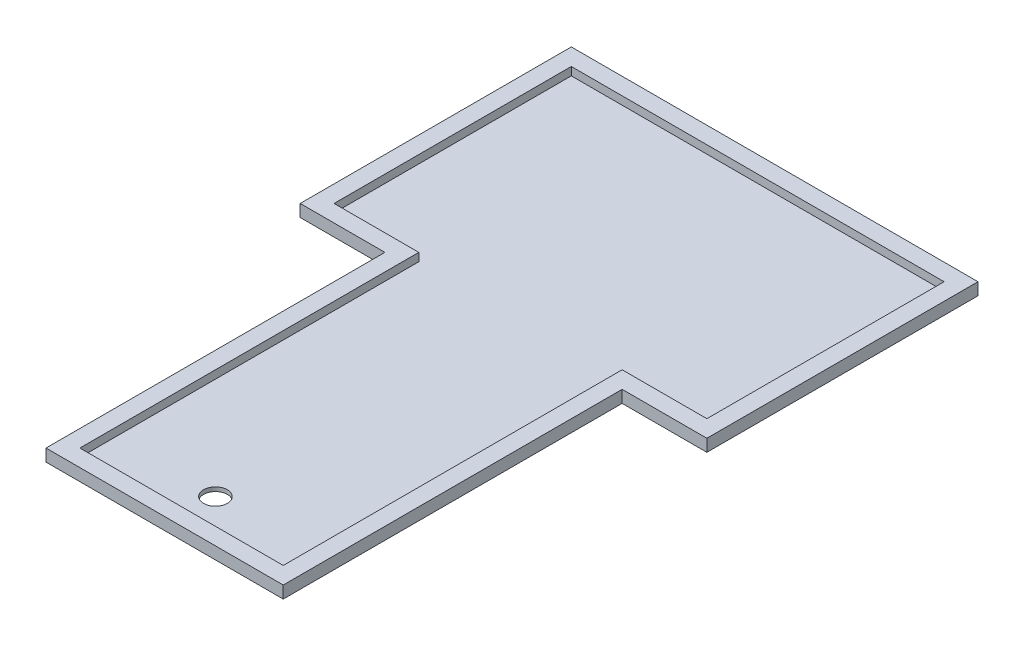
ISO-10303-21;
HEADER;
FILE_DESCRIPTION(('STEP AP214'),'2;1');
FILE_NAME('part.step','',(''),(''),'','','');
FILE_SCHEMA(('AUTOMOTIVE_DESIGN { 1 0 10303 214 1 1 1 1 }'));
ENDSEC;
DATA;
#1=APPLICATION_CONTEXT('core data for automotive mechanical design processes');
#2=APPLICATION_PROTOCOL_DEFINITION('international standard','automotive_design',2000,#1);
#3=PRODUCT_CONTEXT('',#1,'mechanical');
#4=PRODUCT('Part','Part','',(#3));
#5=PRODUCT_RELATED_PRODUCT_CATEGORY('part','',(#4));
#6=PRODUCT_DEFINITION_FORMATION('','',#4);
#7=PRODUCT_DEFINITION_CONTEXT('part definition',#1,'design');
#8=PRODUCT_DEFINITION('design','',#6,#7);
#9=PRODUCT_DEFINITION_SHAPE('','',#8);
#10=(LENGTH_UNIT() NAMED_UNIT(*) SI_UNIT(.MILLI.,.METRE.));
#11=(NAMED_UNIT(*) PLANE_ANGLE_UNIT() SI_UNIT($,.RADIAN.));
#12=(NAMED_UNIT(*) SI_UNIT($,.STERADIAN.) SOLID_ANGLE_UNIT());
#13=UNCERTAINTY_MEASURE_WITH_UNIT(LENGTH_MEASURE(1.E-05),#10,'distance_accuracy_value','');
#14=(GEOMETRIC_REPRESENTATION_CONTEXT(3) GLOBAL_UNCERTAINTY_ASSIGNED_CONTEXT((#13)) GLOBAL_UNIT_ASSIGNED_CONTEXT((#10,
#11,#12)) REPRESENTATION_CONTEXT('',''));
#15=CARTESIAN_POINT('',(0.,0.,0.));
#16=DIRECTION('',(0.,0.,1.));
#17=DIRECTION('',(1.,0.,0.));
#18=AXIS2_PLACEMENT_3D('',#15,#16,#17);
#19=CARTESIAN_POINT('',(0.,1.2,0.));
#20=DIRECTION('',(0.,-1.,0.));
#21=DIRECTION('',(0.,0.,-1.));
#22=AXIS2_PLACEMENT_3D('',#19,#20,#21);
#23=PLANE('',#22);
#24=DIRECTION('',(0.,0.,-1.));
#25=VECTOR('',#24,1.);
#26=CARTESIAN_POINT('',(55.,1.2,35.));
#27=LINE('',#26,#25);
#28=CARTESIAN_POINT('',(55.,1.2,35.));
#29=VERTEX_POINT('',#28);
#30=CARTESIAN_POINT('',(55.,1.2,-35.));
#31=VERTEX_POINT('',#30);
#32=EDGE_CURVE('E159',#29,#31,#27,.T.);
#33=ORIENTED_EDGE('',*,*,#32,.T.);
#34=DIRECTION('',(-1.,0.,0.));
#35=VECTOR('',#34,1.);
#36=CARTESIAN_POINT('',(-55.,1.2,-35.));
#37=LINE('',#36,#35);
#38=CARTESIAN_POINT('',(-55.,1.2,-35.));
#39=VERTEX_POINT('',#38);
#40=EDGE_CURVE('E48',#31,#39,#37,.T.);
#41=ORIENTED_EDGE('',*,*,#40,.T.);
#42=DIRECTION('',(0.,0.,1.));
#43=VECTOR('',#42,1.);
#44=CARTESIAN_POINT('',(-55.,1.2,35.));
#45=LINE('',#44,#43);
#46=CARTESIAN_POINT('',(-55.,1.2,35.));
#47=VERTEX_POINT('',#46);
#48=EDGE_CURVE('E184',#39,#47,#45,.T.);
#49=ORIENTED_EDGE('',*,*,#48,.T.);
#50=DIRECTION('',(1.,0.,0.));
#51=VECTOR('',#50,1.);
#52=CARTESIAN_POINT('',(-55.,1.2,35.));
#53=LINE('',#52,#51);
#54=CARTESIAN_POINT('',(-30.,1.2,35.));
#55=VERTEX_POINT('',#54);
#56=EDGE_CURVE('E187',#47,#55,#53,.T.);
#57=ORIENTED_EDGE('',*,*,#56,.T.);
#58=DIRECTION('',(0.,0.,1.));
#59=VECTOR('',#58,1.);
#60=CARTESIAN_POINT('',(-30.,1.2,135.));
#61=LINE('',#60,#59);
#62=CARTESIAN_POINT('',(-30.,1.2,135.));
#63=VERTEX_POINT('',#62);
#64=EDGE_CURVE('E190',#55,#63,#61,.T.);
#65=ORIENTED_EDGE('',*,*,#64,.T.);
#66=DIRECTION('',(1.,0.,0.));
#67=VECTOR('',#66,1.);
#68=CARTESIAN_POINT('',(30.,1.2,135.));
#69=LINE('',#68,#67);
#70=CARTESIAN_POINT('',(30.,1.2,135.));
#71=VERTEX_POINT('',#70);
#72=EDGE_CURVE('E193',#63,#71,#69,.T.);
#73=ORIENTED_EDGE('',*,*,#72,.T.);
#74=DIRECTION('',(0.,0.,-1.));
#75=VECTOR('',#74,1.);
#76=CARTESIAN_POINT('',(30.,1.2,35.));
#77=LINE('',#76,#75);
#78=CARTESIAN_POINT('',(30.,1.2,35.));
#79=VERTEX_POINT('',#78);
#80=EDGE_CURVE('E196',#71,#79,#77,.T.);
#81=ORIENTED_EDGE('',*,*,#80,.T.);
#82=DIRECTION('',(1.,0.,0.));
#83=VECTOR('',#82,1.);
#84=CARTESIAN_POINT('',(30.,1.2,35.));
#85=LINE('',#84,#83);
#86=EDGE_CURVE('E199',#79,#29,#85,.T.);
#87=ORIENTED_EDGE('',*,*,#86,.T.);
#88=EDGE_LOOP('',(#33,#41,#49,#57,#65,#73,#81,#87));
#89=FACE_BOUND('',#88,.T.);
#90=CARTESIAN_POINT('',(0.,1.2,125.));
#91=DIRECTION('',(0.,1.,0.));
#92=DIRECTION('',(0.,0.,1.));
#93=AXIS2_PLACEMENT_3D('',#90,#91,#92);
#94=CIRCLE('',#93,3.5);
#95=CARTESIAN_POINT('',(0.,1.2,128.5));
#96=VERTEX_POINT('',#95);
#97=EDGE_CURVE('E239',#96,#96,#94,.T.);
#98=ORIENTED_EDGE('',*,*,#97,.F.);
#99=EDGE_LOOP('',(#98));
#100=FACE_BOUND('',#99,.T.);
#101=ADVANCED_FACE('F33',(#89,#100),#23,.F.);
#102=CARTESIAN_POINT('',(0.,0.,0.));
#103=DIRECTION('',(0.,-1.,0.));
#104=DIRECTION('',(0.,0.,-1.));
#105=AXIS2_PLACEMENT_3D('',#102,#103,#104);
#106=PLANE('',#105);
#107=DIRECTION('',(0.,0.,-1.));
#108=VECTOR('',#107,1.);
#109=CARTESIAN_POINT('',(60.,0.,40.));
#110=LINE('',#109,#108);
#111=CARTESIAN_POINT('',(60.,0.,40.));
#112=VERTEX_POINT('',#111);
#113=CARTESIAN_POINT('',(60.,0.,-40.));
#114=VERTEX_POINT('',#113);
#115=EDGE_CURVE('E242',#112,#114,#110,.T.);
#116=ORIENTED_EDGE('',*,*,#115,.F.);
#117=DIRECTION('',(1.,0.,0.));
#118=VECTOR('',#117,1.);
#119=CARTESIAN_POINT('',(35.,0.,40.));
#120=LINE('',#119,#118);
#121=CARTESIAN_POINT('',(35.,0.,40.));
#122=VERTEX_POINT('',#121);
#123=EDGE_CURVE('E56',#122,#112,#120,.T.);
#124=ORIENTED_EDGE('',*,*,#123,.F.);
#125=DIRECTION('',(0.,0.,-1.));
#126=VECTOR('',#125,1.);
#127=CARTESIAN_POINT('',(35.,0.,140.));
#128=LINE('',#127,#126);
#129=CARTESIAN_POINT('',(35.,0.,140.));
#130=VERTEX_POINT('',#129);
#131=EDGE_CURVE('E257',#130,#122,#128,.T.);
#132=ORIENTED_EDGE('',*,*,#131,.F.);
#133=DIRECTION('',(1.,0.,0.));
#134=VECTOR('',#133,1.);
#135=CARTESIAN_POINT('',(-35.,0.,140.));
#136=LINE('',#135,#134);
#137=CARTESIAN_POINT('',(-35.,0.,140.));
#138=VERTEX_POINT('',#137);
#139=EDGE_CURVE('E255',#138,#130,#136,.T.);
#140=ORIENTED_EDGE('',*,*,#139,.F.);
#141=DIRECTION('',(0.,0.,1.));
#142=VECTOR('',#141,1.);
#143=CARTESIAN_POINT('',(-35.,0.,140.));
#144=LINE('',#143,#142);
#145=CARTESIAN_POINT('',(-35.,0.,40.));
#146=VERTEX_POINT('',#145);
#147=EDGE_CURVE('E253',#146,#138,#144,.T.);
#148=ORIENTED_EDGE('',*,*,#147,.F.);
#149=DIRECTION('',(1.,0.,0.));
#150=VECTOR('',#149,1.);
#151=CARTESIAN_POINT('',(-60.,0.,40.));
#152=LINE('',#151,#150);
#153=CARTESIAN_POINT('',(-60.,0.,40.));
#154=VERTEX_POINT('',#153);
#155=EDGE_CURVE('E251',#154,#146,#152,.T.);
#156=ORIENTED_EDGE('',*,*,#155,.F.);
#157=DIRECTION('',(0.,0.,1.));
#158=VECTOR('',#157,1.);
#159=CARTESIAN_POINT('',(-60.,0.,40.));
#160=LINE('',#159,#158);
#161=CARTESIAN_POINT('',(-60.,0.,-40.));
#162=VERTEX_POINT('',#161);
#163=EDGE_CURVE('E249',#162,#154,#160,.T.);
#164=ORIENTED_EDGE('',*,*,#163,.F.);
#165=DIRECTION('',(-1.,0.,0.));
#166=VECTOR('',#165,1.);
#167=CARTESIAN_POINT('',(-60.,0.,-40.));
#168=LINE('',#167,#166);
#169=EDGE_CURVE('E247',#114,#162,#168,.T.);
#170=ORIENTED_EDGE('',*,*,#169,.F.);
#171=EDGE_LOOP('',(#116,#124,#132,#140,#148,#156,#164,#170));
#172=FACE_BOUND('',#171,.T.);
#173=CARTESIAN_POINT('',(0.,0.,125.));
#174=DIRECTION('',(0.,1.,0.));
#175=DIRECTION('',(0.,0.,1.));
#176=AXIS2_PLACEMENT_3D('',#173,#174,#175);
#177=CIRCLE('',#176,3.5);
#178=CARTESIAN_POINT('',(0.,0.,128.5));
#179=VERTEX_POINT('',#178);
#180=EDGE_CURVE('E238',#179,#179,#177,.T.);
#181=ORIENTED_EDGE('',*,*,#180,.T.);
#182=EDGE_LOOP('',(#181));
#183=FACE_BOUND('',#182,.T.);
#184=ADVANCED_FACE('F285',(#172,#183),#106,.T.);
#185=CARTESIAN_POINT('',(60.,1.2,40.));
#186=DIRECTION('',(-1.,0.,0.));
#187=DIRECTION('',(0.,0.,1.));
#188=AXIS2_PLACEMENT_3D('',#185,#186,#187);
#189=PLANE('',#188);
#190=ORIENTED_EDGE('',*,*,#115,.T.);
#191=DIRECTION('',(0.,-1.,0.));
#192=VECTOR('',#191,1.);
#193=CARTESIAN_POINT('',(60.,1.2,-40.));
#194=LINE('',#193,#192);
#195=CARTESIAN_POINT('',(60.,3.6,-40.));
#196=VERTEX_POINT('',#195);
#197=EDGE_CURVE('E11',#196,#114,#194,.T.);
#198=ORIENTED_EDGE('',*,*,#197,.F.);
#199=DIRECTION('',(0.,0.,-1.));
#200=VECTOR('',#199,1.);
#201=CARTESIAN_POINT('',(59.9999999999999,3.6,0.));
#202=LINE('',#201,#200);
#203=CARTESIAN_POINT('',(60.,3.6,40.));
#204=VERTEX_POINT('',#203);
#205=EDGE_CURVE('E163',#204,#196,#202,.T.);
#206=ORIENTED_EDGE('',*,*,#205,.F.);
#207=DIRECTION('',(0.,-1.,0.));
#208=VECTOR('',#207,1.);
#209=CARTESIAN_POINT('',(60.,1.2,40.));
#210=LINE('',#209,#208);
#211=EDGE_CURVE('E260',#204,#112,#210,.T.);
#212=ORIENTED_EDGE('',*,*,#211,.T.);
#213=EDGE_LOOP('',(#190,#198,#206,#212));
#214=FACE_BOUND('',#213,.T.);
#215=ADVANCED_FACE('F35',(#214),#189,.F.);
#216=CARTESIAN_POINT('',(-60.,1.2,-40.));
#217=DIRECTION('',(0.,0.,1.));
#218=DIRECTION('',(1.,0.,0.));
#219=AXIS2_PLACEMENT_3D('',#216,#217,#218);
#220=PLANE('',#219);
#221=ORIENTED_EDGE('',*,*,#169,.T.);
#222=DIRECTION('',(0.,-1.,0.));
#223=VECTOR('',#222,1.);
#224=CARTESIAN_POINT('',(-60.,1.2,-40.));
#225=LINE('',#224,#223);
#226=CARTESIAN_POINT('',(-60.,3.6,-40.));
#227=VERTEX_POINT('',#226);
#228=EDGE_CURVE('E41',#227,#162,#225,.T.);
#229=ORIENTED_EDGE('',*,*,#228,.F.);
#230=DIRECTION('',(-1.,0.,0.));
#231=VECTOR('',#230,1.);
#232=CARTESIAN_POINT('',(-60.,3.6,-40.));
#233=LINE('',#232,#231);
#234=EDGE_CURVE('E217',#196,#227,#233,.T.);
#235=ORIENTED_EDGE('',*,*,#234,.F.);
#236=ORIENTED_EDGE('',*,*,#197,.T.);
#237=EDGE_LOOP('',(#221,#229,#235,#236));
#238=FACE_BOUND('',#237,.T.);
#239=ADVANCED_FACE('F307',(#238),#220,.F.);
#240=CARTESIAN_POINT('',(-60.,1.2,40.));
#241=DIRECTION('',(1.,0.,0.));
#242=DIRECTION('',(0.,0.,-1.));
#243=AXIS2_PLACEMENT_3D('',#240,#241,#242);
#244=PLANE('',#243);
#245=ORIENTED_EDGE('',*,*,#163,.T.);
#246=DIRECTION('',(0.,-1.,0.));
#247=VECTOR('',#246,1.);
#248=CARTESIAN_POINT('',(-60.,1.2,40.));
#249=LINE('',#248,#247);
#250=CARTESIAN_POINT('',(-60.,3.6,40.));
#251=VERTEX_POINT('',#250);
#252=EDGE_CURVE('E273',#251,#154,#249,.T.);
#253=ORIENTED_EDGE('',*,*,#252,.F.);
#254=DIRECTION('',(0.,0.,1.));
#255=VECTOR('',#254,1.);
#256=CARTESIAN_POINT('',(-60.,3.6,0.));
#257=LINE('',#256,#255);
#258=EDGE_CURVE('E220',#227,#251,#257,.T.);
#259=ORIENTED_EDGE('',*,*,#258,.F.);
#260=ORIENTED_EDGE('',*,*,#228,.T.);
#261=EDGE_LOOP('',(#245,#253,#259,#260));
#262=FACE_BOUND('',#261,.T.);
#263=ADVANCED_FACE('F279',(#262),#244,.F.);
#264=CARTESIAN_POINT('',(-60.,1.2,40.));
#265=DIRECTION('',(0.,0.,-1.));
#266=DIRECTION('',(-1.,0.,0.));
#267=AXIS2_PLACEMENT_3D('',#264,#265,#266);
#268=PLANE('',#267);
#269=ORIENTED_EDGE('',*,*,#155,.T.);
#270=DIRECTION('',(0.,-1.,0.));
#271=VECTOR('',#270,1.);
#272=CARTESIAN_POINT('',(-35.,1.2,40.));
#273=LINE('',#272,#271);
#274=CARTESIAN_POINT('',(-35.,3.6,40.));
#275=VERTEX_POINT('',#274);
#276=EDGE_CURVE('E270',#275,#146,#273,.T.);
#277=ORIENTED_EDGE('',*,*,#276,.F.);
#278=DIRECTION('',(1.,0.,0.));
#279=VECTOR('',#278,1.);
#280=CARTESIAN_POINT('',(-60.,3.6,40.));
#281=LINE('',#280,#279);
#282=EDGE_CURVE('E223',#251,#275,#281,.T.);
#283=ORIENTED_EDGE('',*,*,#282,.F.);
#284=ORIENTED_EDGE('',*,*,#252,.T.);
#285=EDGE_LOOP('',(#269,#277,#283,#284));
#286=FACE_BOUND('',#285,.T.);
#287=ADVANCED_FACE('F290',(#286),#268,.F.);
#288=CARTESIAN_POINT('',(-35.,1.2,140.));
#289=DIRECTION('',(1.,0.,0.));
#290=DIRECTION('',(0.,0.,-1.));
#291=AXIS2_PLACEMENT_3D('',#288,#289,#290);
#292=PLANE('',#291);
#293=ORIENTED_EDGE('',*,*,#147,.T.);
#294=DIRECTION('',(0.,-1.,0.));
#295=VECTOR('',#294,1.);
#296=CARTESIAN_POINT('',(-35.,1.2,140.));
#297=LINE('',#296,#295);
#298=CARTESIAN_POINT('',(-35.,3.6,140.));
#299=VERTEX_POINT('',#298);
#300=EDGE_CURVE('E267',#299,#138,#297,.T.);
#301=ORIENTED_EDGE('',*,*,#300,.F.);
#302=DIRECTION('',(0.,0.,1.));
#303=VECTOR('',#302,1.);
#304=CARTESIAN_POINT('',(-35.,3.6,40.));
#305=LINE('',#304,#303);
#306=EDGE_CURVE('E226',#275,#299,#305,.T.);
#307=ORIENTED_EDGE('',*,*,#306,.F.);
#308=ORIENTED_EDGE('',*,*,#276,.T.);
#309=EDGE_LOOP('',(#293,#301,#307,#308));
#310=FACE_BOUND('',#309,.T.);
#311=ADVANCED_FACE('F294',(#310),#292,.F.);
#312=CARTESIAN_POINT('',(-35.,1.2,140.));
#313=DIRECTION('',(0.,0.,-1.));
#314=DIRECTION('',(-1.,0.,0.));
#315=AXIS2_PLACEMENT_3D('',#312,#313,#314);
#316=PLANE('',#315);
#317=ORIENTED_EDGE('',*,*,#139,.T.);
#318=DIRECTION('',(0.,-1.,0.));
#319=VECTOR('',#318,1.);
#320=CARTESIAN_POINT('',(35.,1.2,140.));
#321=LINE('',#320,#319);
#322=CARTESIAN_POINT('',(35.,3.6,140.));
#323=VERTEX_POINT('',#322);
#324=EDGE_CURVE('E264',#323,#130,#321,.T.);
#325=ORIENTED_EDGE('',*,*,#324,.F.);
#326=DIRECTION('',(1.,0.,0.));
#327=VECTOR('',#326,1.);
#328=CARTESIAN_POINT('',(-35.,3.6,140.));
#329=LINE('',#328,#327);
#330=EDGE_CURVE('E229',#299,#323,#329,.T.);
#331=ORIENTED_EDGE('',*,*,#330,.F.);
#332=ORIENTED_EDGE('',*,*,#300,.T.);
#333=EDGE_LOOP('',(#317,#325,#331,#332));
#334=FACE_BOUND('',#333,.T.);
#335=ADVANCED_FACE('F299',(#334),#316,.F.);
#336=CARTESIAN_POINT('',(35.,1.2,140.));
#337=DIRECTION('',(-1.,0.,0.));
#338=DIRECTION('',(0.,0.,1.));
#339=AXIS2_PLACEMENT_3D('',#336,#337,#338);
#340=PLANE('',#339);
#341=ORIENTED_EDGE('',*,*,#131,.T.);
#342=DIRECTION('',(0.,-1.,0.));
#343=VECTOR('',#342,1.);
#344=CARTESIAN_POINT('',(35.,1.2,40.));
#345=LINE('',#344,#343);
#346=CARTESIAN_POINT('',(35.,3.6,40.));
#347=VERTEX_POINT('',#346);
#348=EDGE_CURVE('E262',#347,#122,#345,.T.);
#349=ORIENTED_EDGE('',*,*,#348,.F.);
#350=DIRECTION('',(0.,0.,-1.));
#351=VECTOR('',#350,1.);
#352=CARTESIAN_POINT('',(35.,3.6,140.));
#353=LINE('',#352,#351);
#354=EDGE_CURVE('E232',#323,#347,#353,.T.);
#355=ORIENTED_EDGE('',*,*,#354,.F.);
#356=ORIENTED_EDGE('',*,*,#324,.T.);
#357=EDGE_LOOP('',(#341,#349,#355,#356));
#358=FACE_BOUND('',#357,.T.);
#359=ADVANCED_FACE('F302',(#358),#340,.F.);
#360=CARTESIAN_POINT('',(35.,1.2,40.));
#361=DIRECTION('',(0.,0.,-1.));
#362=DIRECTION('',(-1.,0.,0.));
#363=AXIS2_PLACEMENT_3D('',#360,#361,#362);
#364=PLANE('',#363);
#365=ORIENTED_EDGE('',*,*,#123,.T.);
#366=ORIENTED_EDGE('',*,*,#211,.F.);
#367=DIRECTION('',(1.,0.,0.));
#368=VECTOR('',#367,1.);
#369=CARTESIAN_POINT('',(35.,3.6,40.));
#370=LINE('',#369,#368);
#371=EDGE_CURVE('E235',#347,#204,#370,.T.);
#372=ORIENTED_EDGE('',*,*,#371,.F.);
#373=ORIENTED_EDGE('',*,*,#348,.T.);
#374=EDGE_LOOP('',(#365,#366,#372,#373));
#375=FACE_BOUND('',#374,.T.);
#376=ADVANCED_FACE('F306',(#375),#364,.F.);
#377=CARTESIAN_POINT('',(0.,1.2,125.));
#378=DIRECTION('',(0.,-1.,0.));
#379=DIRECTION('',(0.,0.,-1.));
#380=AXIS2_PLACEMENT_3D('',#377,#378,#379);
#381=CYLINDRICAL_SURFACE('',#380,3.5);
#382=ORIENTED_EDGE('',*,*,#97,.T.);
#383=EDGE_LOOP('',(#382));
#384=FACE_BOUND('',#383,.T.);
#385=ORIENTED_EDGE('',*,*,#180,.F.);
#386=EDGE_LOOP('',(#385));
#387=FACE_BOUND('',#386,.T.);
#388=ADVANCED_FACE('F323',(#384,#387),#381,.F.);
#389=CARTESIAN_POINT('',(0.,3.6,0.));
#390=DIRECTION('',(0.,-1.,0.));
#391=DIRECTION('',(0.,0.,-1.));
#392=AXIS2_PLACEMENT_3D('',#389,#390,#391);
#393=PLANE('',#392);
#394=ORIENTED_EDGE('',*,*,#205,.T.);
#395=ORIENTED_EDGE('',*,*,#234,.T.);
#396=ORIENTED_EDGE('',*,*,#258,.T.);
#397=ORIENTED_EDGE('',*,*,#282,.T.);
#398=ORIENTED_EDGE('',*,*,#306,.T.);
#399=ORIENTED_EDGE('',*,*,#330,.T.);
#400=ORIENTED_EDGE('',*,*,#354,.T.);
#401=ORIENTED_EDGE('',*,*,#371,.T.);
#402=EDGE_LOOP('',(#394,#395,#396,#397,#398,#399,#400,#401));
#403=FACE_BOUND('',#402,.T.);
#404=DIRECTION('',(-1.,0.,0.));
#405=VECTOR('',#404,1.);
#406=CARTESIAN_POINT('',(-55.,3.6,-35.));
#407=LINE('',#406,#405);
#408=CARTESIAN_POINT('',(55.,3.6,-35.));
#409=VERTEX_POINT('',#408);
#410=CARTESIAN_POINT('',(-55.,3.6,-35.));
#411=VERTEX_POINT('',#410);
#412=EDGE_CURVE('E158',#409,#411,#407,.T.);
#413=ORIENTED_EDGE('',*,*,#412,.F.);
#414=DIRECTION('',(0.,0.,-1.));
#415=VECTOR('',#414,1.);
#416=CARTESIAN_POINT('',(55.,3.6,0.));
#417=LINE('',#416,#415);
#418=CARTESIAN_POINT('',(55.,3.6,35.));
#419=VERTEX_POINT('',#418);
#420=EDGE_CURVE('E148',#419,#409,#417,.T.);
#421=ORIENTED_EDGE('',*,*,#420,.F.);
#422=DIRECTION('',(1.,0.,0.));
#423=VECTOR('',#422,1.);
#424=CARTESIAN_POINT('',(30.,3.6,35.));
#425=LINE('',#424,#423);
#426=CARTESIAN_POINT('',(30.,3.6,35.));
#427=VERTEX_POINT('',#426);
#428=EDGE_CURVE('E181',#427,#419,#425,.T.);
#429=ORIENTED_EDGE('',*,*,#428,.F.);
#430=DIRECTION('',(0.,0.,-1.));
#431=VECTOR('',#430,1.);
#432=CARTESIAN_POINT('',(30.,3.6,35.));
#433=LINE('',#432,#431);
#434=CARTESIAN_POINT('',(30.,3.6,135.));
#435=VERTEX_POINT('',#434);
#436=EDGE_CURVE('E179',#435,#427,#433,.T.);
#437=ORIENTED_EDGE('',*,*,#436,.F.);
#438=DIRECTION('',(1.,0.,0.));
#439=VECTOR('',#438,1.);
#440=CARTESIAN_POINT('',(30.,3.6,135.));
#441=LINE('',#440,#439);
#442=CARTESIAN_POINT('',(-30.,3.6,135.));
#443=VERTEX_POINT('',#442);
#444=EDGE_CURVE('E177',#443,#435,#441,.T.);
#445=ORIENTED_EDGE('',*,*,#444,.F.);
#446=DIRECTION('',(0.,0.,1.));
#447=VECTOR('',#446,1.);
#448=CARTESIAN_POINT('',(-30.,3.6,135.));
#449=LINE('',#448,#447);
#450=CARTESIAN_POINT('',(-30.,3.6,35.));
#451=VERTEX_POINT('',#450);
#452=EDGE_CURVE('E175',#451,#443,#449,.T.);
#453=ORIENTED_EDGE('',*,*,#452,.F.);
#454=DIRECTION('',(1.,0.,0.));
#455=VECTOR('',#454,1.);
#456=CARTESIAN_POINT('',(-55.,3.6,35.));
#457=LINE('',#456,#455);
#458=CARTESIAN_POINT('',(-55.,3.6,35.));
#459=VERTEX_POINT('',#458);
#460=EDGE_CURVE('E171',#459,#451,#457,.T.);
#461=ORIENTED_EDGE('',*,*,#460,.F.);
#462=DIRECTION('',(0.,0.,1.));
#463=VECTOR('',#462,1.);
#464=CARTESIAN_POINT('',(-55.,3.6,0.));
#465=LINE('',#464,#463);
#466=EDGE_CURVE('E169',#411,#459,#465,.T.);
#467=ORIENTED_EDGE('',*,*,#466,.F.);
#468=EDGE_LOOP('',(#413,#421,#429,#437,#445,#453,#461,#467));
#469=FACE_BOUND('',#468,.T.);
#470=ADVANCED_FACE('F167',(#403,#469),#393,.F.);
#471=CARTESIAN_POINT('',(-55.,3.6,-35.));
#472=DIRECTION('',(0.,0.,1.));
#473=DIRECTION('',(1.,0.,0.));
#474=AXIS2_PLACEMENT_3D('',#471,#472,#473);
#475=PLANE('',#474);
#476=ORIENTED_EDGE('',*,*,#40,.F.);
#477=DIRECTION('',(0.,-1.,0.));
#478=VECTOR('',#477,1.);
#479=CARTESIAN_POINT('',(55.,3.6,-35.));
#480=LINE('',#479,#478);
#481=EDGE_CURVE('E151',#409,#31,#480,.T.);
#482=ORIENTED_EDGE('',*,*,#481,.F.);
#483=ORIENTED_EDGE('',*,*,#412,.T.);
#484=DIRECTION('',(0.,-1.,0.));
#485=VECTOR('',#484,1.);
#486=CARTESIAN_POINT('',(-55.,3.6,-35.));
#487=LINE('',#486,#485);
#488=EDGE_CURVE('E164',#411,#39,#487,.T.);
#489=ORIENTED_EDGE('',*,*,#488,.T.);
#490=EDGE_LOOP('',(#476,#482,#483,#489));
#491=FACE_BOUND('',#490,.T.);
#492=ADVANCED_FACE('F161',(#491),#475,.T.);
#493=CARTESIAN_POINT('',(-55.,3.6,35.));
#494=DIRECTION('',(1.,0.,0.));
#495=DIRECTION('',(0.,0.,-1.));
#496=AXIS2_PLACEMENT_3D('',#493,#494,#495);
#497=PLANE('',#496);
#498=ORIENTED_EDGE('',*,*,#48,.F.);
#499=ORIENTED_EDGE('',*,*,#488,.F.);
#500=ORIENTED_EDGE('',*,*,#466,.T.);
#501=DIRECTION('',(0.,-1.,0.));
#502=VECTOR('',#501,1.);
#503=CARTESIAN_POINT('',(-55.,3.6,35.));
#504=LINE('',#503,#502);
#505=EDGE_CURVE('E212',#459,#47,#504,.T.);
#506=ORIENTED_EDGE('',*,*,#505,.T.);
#507=EDGE_LOOP('',(#498,#499,#500,#506));
#508=FACE_BOUND('',#507,.T.);
#509=ADVANCED_FACE('F373',(#508),#497,.T.);
#510=CARTESIAN_POINT('',(-55.,3.6,35.));
#511=DIRECTION('',(0.,0.,-1.));
#512=DIRECTION('',(-1.,0.,0.));
#513=AXIS2_PLACEMENT_3D('',#510,#511,#512);
#514=PLANE('',#513);
#515=ORIENTED_EDGE('',*,*,#56,.F.);
#516=ORIENTED_EDGE('',*,*,#505,.F.);
#517=ORIENTED_EDGE('',*,*,#460,.T.);
#518=DIRECTION('',(0.,-1.,0.));
#519=VECTOR('',#518,1.);
#520=CARTESIAN_POINT('',(-30.,3.6,35.));
#521=LINE('',#520,#519);
#522=EDGE_CURVE('E210',#451,#55,#521,.T.);
#523=ORIENTED_EDGE('',*,*,#522,.T.);
#524=EDGE_LOOP('',(#515,#516,#517,#523));
#525=FACE_BOUND('',#524,.T.);
#526=ADVANCED_FACE('F380',(#525),#514,.T.);
#527=CARTESIAN_POINT('',(-30.,3.6,135.));
#528=DIRECTION('',(1.,0.,0.));
#529=DIRECTION('',(0.,0.,-1.));
#530=AXIS2_PLACEMENT_3D('',#527,#528,#529);
#531=PLANE('',#530);
#532=ORIENTED_EDGE('',*,*,#64,.F.);
#533=ORIENTED_EDGE('',*,*,#522,.F.);
#534=ORIENTED_EDGE('',*,*,#452,.T.);
#535=DIRECTION('',(0.,-1.,0.));
#536=VECTOR('',#535,1.);
#537=CARTESIAN_POINT('',(-30.,3.6,135.));
#538=LINE('',#537,#536);
#539=EDGE_CURVE('E208',#443,#63,#538,.T.);
#540=ORIENTED_EDGE('',*,*,#539,.T.);
#541=EDGE_LOOP('',(#532,#533,#534,#540));
#542=FACE_BOUND('',#541,.T.);
#543=ADVANCED_FACE('F388',(#542),#531,.T.);
#544=CARTESIAN_POINT('',(30.,3.6,135.));
#545=DIRECTION('',(0.,0.,-1.));
#546=DIRECTION('',(-1.,0.,0.));
#547=AXIS2_PLACEMENT_3D('',#544,#545,#546);
#548=PLANE('',#547);
#549=ORIENTED_EDGE('',*,*,#72,.F.);
#550=ORIENTED_EDGE('',*,*,#539,.F.);
#551=ORIENTED_EDGE('',*,*,#444,.T.);
#552=DIRECTION('',(0.,-1.,0.));
#553=VECTOR('',#552,1.);
#554=CARTESIAN_POINT('',(30.,3.6,135.));
#555=LINE('',#554,#553);
#556=EDGE_CURVE('E206',#435,#71,#555,.T.);
#557=ORIENTED_EDGE('',*,*,#556,.T.);
#558=EDGE_LOOP('',(#549,#550,#551,#557));
#559=FACE_BOUND('',#558,.T.);
#560=ADVANCED_FACE('F396',(#559),#548,.T.);
#561=CARTESIAN_POINT('',(30.,3.6,35.));
#562=DIRECTION('',(-1.,0.,0.));
#563=DIRECTION('',(0.,0.,1.));
#564=AXIS2_PLACEMENT_3D('',#561,#562,#563);
#565=PLANE('',#564);
#566=ORIENTED_EDGE('',*,*,#80,.F.);
#567=ORIENTED_EDGE('',*,*,#556,.F.);
#568=ORIENTED_EDGE('',*,*,#436,.T.);
#569=DIRECTION('',(0.,-1.,0.));
#570=VECTOR('',#569,1.);
#571=CARTESIAN_POINT('',(30.,3.6,35.));
#572=LINE('',#571,#570);
#573=EDGE_CURVE('E204',#427,#79,#572,.T.);
#574=ORIENTED_EDGE('',*,*,#573,.T.);
#575=EDGE_LOOP('',(#566,#567,#568,#574));
#576=FACE_BOUND('',#575,.T.);
#577=ADVANCED_FACE('F404',(#576),#565,.T.);
#578=CARTESIAN_POINT('',(30.,3.6,35.));
#579=DIRECTION('',(0.,0.,-1.));
#580=DIRECTION('',(-1.,0.,0.));
#581=AXIS2_PLACEMENT_3D('',#578,#579,#580);
#582=PLANE('',#581);
#583=ORIENTED_EDGE('',*,*,#86,.F.);
#584=ORIENTED_EDGE('',*,*,#573,.F.);
#585=ORIENTED_EDGE('',*,*,#428,.T.);
#586=DIRECTION('',(0.,-1.,0.));
#587=VECTOR('',#586,1.);
#588=CARTESIAN_POINT('',(55.,3.6,35.));
#589=LINE('',#588,#587);
#590=EDGE_CURVE('E153',#419,#29,#589,.T.);
#591=ORIENTED_EDGE('',*,*,#590,.T.);
#592=EDGE_LOOP('',(#583,#584,#585,#591));
#593=FACE_BOUND('',#592,.T.);
#594=ADVANCED_FACE('F412',(#593),#582,.T.);
#595=CARTESIAN_POINT('',(55.,3.6,35.));
#596=DIRECTION('',(-1.,0.,0.));
#597=DIRECTION('',(0.,0.,1.));
#598=AXIS2_PLACEMENT_3D('',#595,#596,#597);
#599=PLANE('',#598);
#600=ORIENTED_EDGE('',*,*,#32,.F.);
#601=ORIENTED_EDGE('',*,*,#590,.F.);
#602=ORIENTED_EDGE('',*,*,#420,.T.);
#603=ORIENTED_EDGE('',*,*,#481,.T.);
#604=EDGE_LOOP('',(#600,#601,#602,#603));
#605=FACE_BOUND('',#604,.T.);
#606=ADVANCED_FACE('F150',(#605),#599,.T.);
#607=CLOSED_SHELL('',(#101,#184,#215,#239,#263,#287,#311,#335,#359,#376,#388,#470,#492,#509,
#526,#543,#560,#577,#594,#606));
#608=MANIFOLD_SOLID_BREP('B2',#607);
#609=ADVANCED_BREP_SHAPE_REPRESENTATION('',(#18,#608),#14);
#610=SHAPE_DEFINITION_REPRESENTATION(#9,#609);
ENDSEC;
END-ISO-10303-21;
